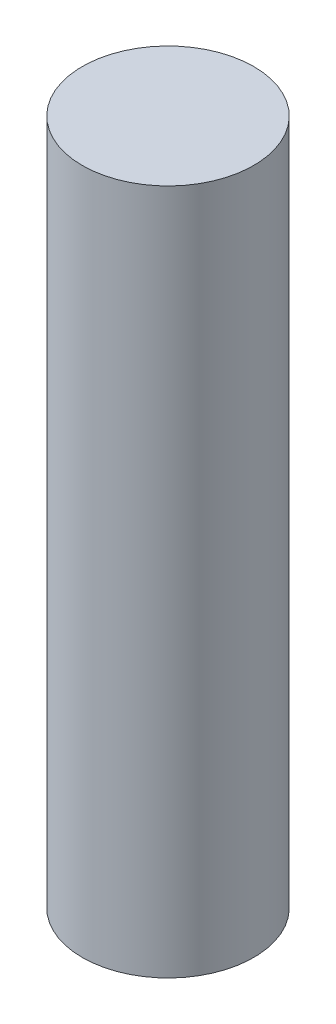
ISO-10303-21;
HEADER;
FILE_DESCRIPTION(('STEP AP214'),'2;1');
FILE_NAME('part.step','',(''),(''),'','','');
FILE_SCHEMA(('AUTOMOTIVE_DESIGN { 1 0 10303 214 1 1 1 1 }'));
ENDSEC;
DATA;
#1=APPLICATION_CONTEXT('core data for automotive mechanical design processes');
#2=APPLICATION_PROTOCOL_DEFINITION('international standard','automotive_design',2000,#1);
#3=PRODUCT_CONTEXT('',#1,'mechanical');
#4=PRODUCT('Part','Part','',(#3));
#5=PRODUCT_RELATED_PRODUCT_CATEGORY('part','',(#4));
#6=PRODUCT_DEFINITION_FORMATION('','',#4);
#7=PRODUCT_DEFINITION_CONTEXT('part definition',#1,'design');
#8=PRODUCT_DEFINITION('design','',#6,#7);
#9=PRODUCT_DEFINITION_SHAPE('','',#8);
#10=(LENGTH_UNIT() NAMED_UNIT(*) SI_UNIT(.MILLI.,.METRE.));
#11=(NAMED_UNIT(*) PLANE_ANGLE_UNIT() SI_UNIT($,.RADIAN.));
#12=(NAMED_UNIT(*) SI_UNIT($,.STERADIAN.) SOLID_ANGLE_UNIT());
#13=UNCERTAINTY_MEASURE_WITH_UNIT(LENGTH_MEASURE(1.E-05),#10,'distance_accuracy_value','');
#14=(GEOMETRIC_REPRESENTATION_CONTEXT(3) GLOBAL_UNCERTAINTY_ASSIGNED_CONTEXT((#13)) GLOBAL_UNIT_ASSIGNED_CONTEXT((#10,
#11,#12)) REPRESENTATION_CONTEXT('',''));
#15=CARTESIAN_POINT('',(0.,0.,0.));
#16=DIRECTION('',(0.,0.,1.));
#17=DIRECTION('',(1.,0.,0.));
#18=AXIS2_PLACEMENT_3D('',#15,#16,#17);
#19=CARTESIAN_POINT('',(0.,750.,0.));
#20=DIRECTION('',(0.,-1.,0.));
#21=DIRECTION('',(0.,0.,-1.));
#22=AXIS2_PLACEMENT_3D('',#19,#20,#21);
#23=CYLINDRICAL_SURFACE('',#22,93.75);
#24=CARTESIAN_POINT('',(0.,750.,0.));
#25=DIRECTION('',(0.,1.,0.));
#26=DIRECTION('',(0.,0.,1.));
#27=AXIS2_PLACEMENT_3D('',#24,#25,#26);
#28=CIRCLE('',#27,93.75);
#29=CARTESIAN_POINT('',(0.,750.,93.75));
#30=VERTEX_POINT('',#29);
#31=EDGE_CURVE('E10',#30,#30,#28,.T.);
#32=ORIENTED_EDGE('',*,*,#31,.F.);
#33=EDGE_LOOP('',(#32));
#34=FACE_BOUND('',#33,.T.);
#35=CARTESIAN_POINT('',(0.,0.,0.));
#36=DIRECTION('',(0.,1.,0.));
#37=DIRECTION('',(0.,0.,1.));
#38=AXIS2_PLACEMENT_3D('',#35,#36,#37);
#39=CIRCLE('',#38,93.75);
#40=CARTESIAN_POINT('',(0.,0.,93.75));
#41=VERTEX_POINT('',#40);
#42=EDGE_CURVE('E34',#41,#41,#39,.T.);
#43=ORIENTED_EDGE('',*,*,#42,.T.);
#44=EDGE_LOOP('',(#43));
#45=FACE_BOUND('',#44,.T.);
#46=ADVANCED_FACE('F31',(#34,#45),#23,.T.);
#47=CARTESIAN_POINT('',(0.,750.,0.));
#48=DIRECTION('',(0.,1.,0.));
#49=DIRECTION('',(0.,0.,1.));
#50=AXIS2_PLACEMENT_3D('',#47,#48,#49);
#51=PLANE('',#50);
#52=ORIENTED_EDGE('',*,*,#31,.T.);
#53=EDGE_LOOP('',(#52));
#54=FACE_BOUND('',#53,.T.);
#55=ADVANCED_FACE('F46',(#54),#51,.T.);
#56=CARTESIAN_POINT('',(0.,0.,0.));
#57=DIRECTION('',(0.,1.,0.));
#58=DIRECTION('',(0.,0.,1.));
#59=AXIS2_PLACEMENT_3D('',#56,#57,#58);
#60=PLANE('',#59);
#61=ORIENTED_EDGE('',*,*,#42,.F.);
#62=EDGE_LOOP('',(#61));
#63=FACE_BOUND('',#62,.T.);
#64=ADVANCED_FACE('F44',(#63),#60,.F.);
#65=CLOSED_SHELL('',(#46,#55,#64));
#66=MANIFOLD_SOLID_BREP('B2',#65);
#67=ADVANCED_BREP_SHAPE_REPRESENTATION('',(#18,#66),#14);
#68=SHAPE_DEFINITION_REPRESENTATION(#9,#67);
ENDSEC;
END-ISO-10303-21;
